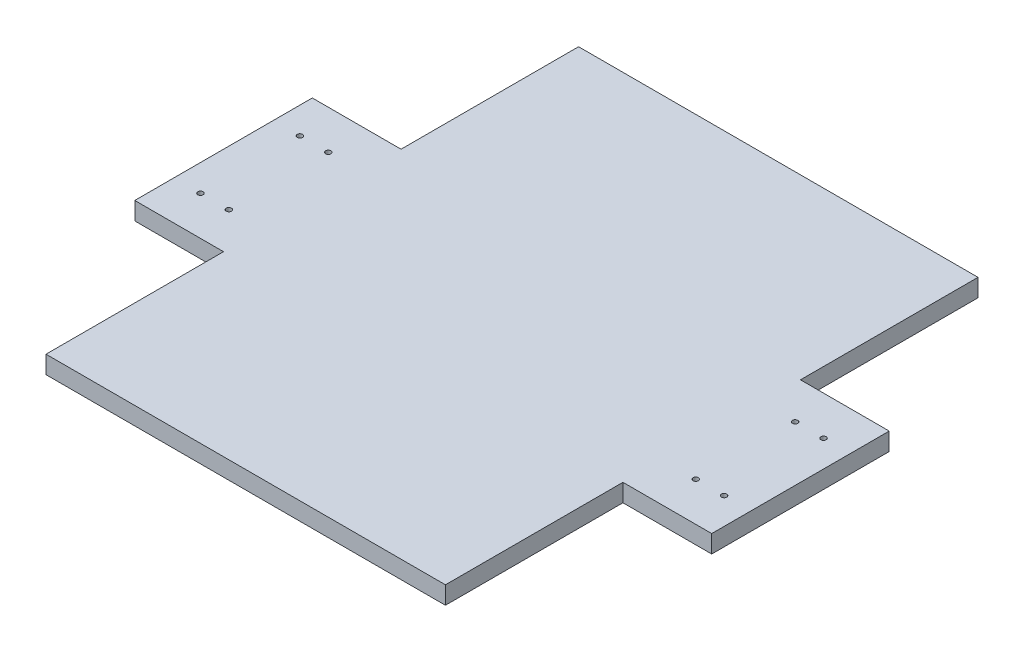
ISO-10303-21;
HEADER;
FILE_DESCRIPTION(('STEP AP214'),'2;1');
FILE_NAME('part.step','',(''),(''),'','','');
FILE_SCHEMA(('AUTOMOTIVE_DESIGN { 1 0 10303 214 1 1 1 1 }'));
ENDSEC;
DATA;
#1=APPLICATION_CONTEXT('core data for automotive mechanical design processes');
#2=APPLICATION_PROTOCOL_DEFINITION('international standard','automotive_design',2000,#1);
#3=PRODUCT_CONTEXT('',#1,'mechanical');
#4=PRODUCT('Part','Part','',(#3));
#5=PRODUCT_RELATED_PRODUCT_CATEGORY('part','',(#4));
#6=PRODUCT_DEFINITION_FORMATION('','',#4);
#7=PRODUCT_DEFINITION_CONTEXT('part definition',#1,'design');
#8=PRODUCT_DEFINITION('design','',#6,#7);
#9=PRODUCT_DEFINITION_SHAPE('','',#8);
#10=(LENGTH_UNIT() NAMED_UNIT(*) SI_UNIT(.MILLI.,.METRE.));
#11=(NAMED_UNIT(*) PLANE_ANGLE_UNIT() SI_UNIT($,.RADIAN.));
#12=(NAMED_UNIT(*) SI_UNIT($,.STERADIAN.) SOLID_ANGLE_UNIT());
#13=UNCERTAINTY_MEASURE_WITH_UNIT(LENGTH_MEASURE(1.E-05),#10,'distance_accuracy_value','');
#14=(GEOMETRIC_REPRESENTATION_CONTEXT(3) GLOBAL_UNCERTAINTY_ASSIGNED_CONTEXT((#13)) GLOBAL_UNIT_ASSIGNED_CONTEXT((#10,
#11,#12)) REPRESENTATION_CONTEXT('',''));
#15=CARTESIAN_POINT('',(0.,0.,0.));
#16=DIRECTION('',(0.,0.,1.));
#17=DIRECTION('',(1.,0.,0.));
#18=AXIS2_PLACEMENT_3D('',#15,#16,#17);
#19=CARTESIAN_POINT('',(225.,20.,300.));
#20=DIRECTION('',(-1.,0.,0.));
#21=DIRECTION('',(0.,0.,1.));
#22=AXIS2_PLACEMENT_3D('',#19,#20,#21);
#23=PLANE('',#22);
#24=DIRECTION('',(0.,0.,-1.));
#25=VECTOR('',#24,1.);
#26=CARTESIAN_POINT('',(225.,0.,300.));
#27=LINE('',#26,#25);
#28=CARTESIAN_POINT('',(225.,0.,300.));
#29=VERTEX_POINT('',#28);
#30=CARTESIAN_POINT('',(225.,0.,100.));
#31=VERTEX_POINT('',#30);
#32=EDGE_CURVE('E153',#29,#31,#27,.T.);
#33=ORIENTED_EDGE('',*,*,#32,.T.);
#34=DIRECTION('',(0.,-1.,0.));
#35=VECTOR('',#34,1.);
#36=CARTESIAN_POINT('',(225.,20.,100.));
#37=LINE('',#36,#35);
#38=CARTESIAN_POINT('',(225.,20.,100.));
#39=VERTEX_POINT('',#38);
#40=EDGE_CURVE('E11',#39,#31,#37,.T.);
#41=ORIENTED_EDGE('',*,*,#40,.F.);
#42=DIRECTION('',(0.,0.,-1.));
#43=VECTOR('',#42,1.);
#44=CARTESIAN_POINT('',(225.,20.,300.));
#45=LINE('',#44,#43);
#46=CARTESIAN_POINT('',(225.,20.,300.));
#47=VERTEX_POINT('',#46);
#48=EDGE_CURVE('E176',#47,#39,#45,.T.);
#49=ORIENTED_EDGE('',*,*,#48,.F.);
#50=DIRECTION('',(0.,-1.,0.));
#51=VECTOR('',#50,1.);
#52=CARTESIAN_POINT('',(225.,20.,300.));
#53=LINE('',#52,#51);
#54=EDGE_CURVE('E149',#47,#29,#53,.T.);
#55=ORIENTED_EDGE('',*,*,#54,.T.);
#56=EDGE_LOOP('',(#33,#41,#49,#55));
#57=FACE_BOUND('',#56,.T.);
#58=ADVANCED_FACE('F33',(#57),#23,.F.);
#59=CARTESIAN_POINT('',(325.,20.,100.));
#60=DIRECTION('',(0.,0.,-1.));
#61=DIRECTION('',(-1.,0.,0.));
#62=AXIS2_PLACEMENT_3D('',#59,#60,#61);
#63=PLANE('',#62);
#64=DIRECTION('',(1.,0.,0.));
#65=VECTOR('',#64,1.);
#66=CARTESIAN_POINT('',(325.,0.,100.));
#67=LINE('',#66,#65);
#68=CARTESIAN_POINT('',(325.,0.,100.));
#69=VERTEX_POINT('',#68);
#70=EDGE_CURVE('E156',#31,#69,#67,.T.);
#71=ORIENTED_EDGE('',*,*,#70,.T.);
#72=DIRECTION('',(0.,-1.,0.));
#73=VECTOR('',#72,1.);
#74=CARTESIAN_POINT('',(325.,20.,100.));
#75=LINE('',#74,#73);
#76=CARTESIAN_POINT('',(325.,20.,100.));
#77=VERTEX_POINT('',#76);
#78=EDGE_CURVE('E41',#77,#69,#75,.T.);
#79=ORIENTED_EDGE('',*,*,#78,.F.);
#80=DIRECTION('',(1.,0.,0.));
#81=VECTOR('',#80,1.);
#82=CARTESIAN_POINT('',(325.,20.,100.));
#83=LINE('',#82,#81);
#84=EDGE_CURVE('E104',#39,#77,#83,.T.);
#85=ORIENTED_EDGE('',*,*,#84,.F.);
#86=ORIENTED_EDGE('',*,*,#40,.T.);
#87=EDGE_LOOP('',(#71,#79,#85,#86));
#88=FACE_BOUND('',#87,.T.);
#89=ADVANCED_FACE('F256',(#88),#63,.F.);
#90=CARTESIAN_POINT('',(325.,20.,100.));
#91=DIRECTION('',(-1.,0.,0.));
#92=DIRECTION('',(0.,0.,1.));
#93=AXIS2_PLACEMENT_3D('',#90,#91,#92);
#94=PLANE('',#93);
#95=DIRECTION('',(0.,0.,-1.));
#96=VECTOR('',#95,1.);
#97=CARTESIAN_POINT('',(325.,0.,100.));
#98=LINE('',#97,#96);
#99=CARTESIAN_POINT('',(325.,0.,-100.));
#100=VERTEX_POINT('',#99);
#101=EDGE_CURVE('E159',#69,#100,#98,.T.);
#102=ORIENTED_EDGE('',*,*,#101,.T.);
#103=DIRECTION('',(0.,-1.,0.));
#104=VECTOR('',#103,1.);
#105=CARTESIAN_POINT('',(325.,20.,-100.));
#106=LINE('',#105,#104);
#107=CARTESIAN_POINT('',(325.,20.,-100.));
#108=VERTEX_POINT('',#107);
#109=EDGE_CURVE('E195',#108,#100,#106,.T.);
#110=ORIENTED_EDGE('',*,*,#109,.F.);
#111=DIRECTION('',(0.,0.,-1.));
#112=VECTOR('',#111,1.);
#113=CARTESIAN_POINT('',(325.,20.,100.));
#114=LINE('',#113,#112);
#115=EDGE_CURVE('E203',#77,#108,#114,.T.);
#116=ORIENTED_EDGE('',*,*,#115,.F.);
#117=ORIENTED_EDGE('',*,*,#78,.T.);
#118=EDGE_LOOP('',(#102,#110,#116,#117));
#119=FACE_BOUND('',#118,.T.);
#120=ADVANCED_FACE('F201',(#119),#94,.F.);
#121=CARTESIAN_POINT('',(325.,20.,-100.));
#122=DIRECTION('',(0.,0.,1.));
#123=DIRECTION('',(1.,0.,0.));
#124=AXIS2_PLACEMENT_3D('',#121,#122,#123);
#125=PLANE('',#124);
#126=DIRECTION('',(-1.,0.,0.));
#127=VECTOR('',#126,1.);
#128=CARTESIAN_POINT('',(325.,0.,-100.));
#129=LINE('',#128,#127);
#130=CARTESIAN_POINT('',(225.,0.,-100.));
#131=VERTEX_POINT('',#130);
#132=EDGE_CURVE('E161',#100,#131,#129,.T.);
#133=ORIENTED_EDGE('',*,*,#132,.T.);
#134=DIRECTION('',(0.,-1.,0.));
#135=VECTOR('',#134,1.);
#136=CARTESIAN_POINT('',(225.,20.,-100.));
#137=LINE('',#136,#135);
#138=CARTESIAN_POINT('',(225.,20.,-100.));
#139=VERTEX_POINT('',#138);
#140=EDGE_CURVE('E192',#139,#131,#137,.T.);
#141=ORIENTED_EDGE('',*,*,#140,.F.);
#142=DIRECTION('',(-1.,0.,0.));
#143=VECTOR('',#142,1.);
#144=CARTESIAN_POINT('',(325.,20.,-100.));
#145=LINE('',#144,#143);
#146=EDGE_CURVE('E221',#108,#139,#145,.T.);
#147=ORIENTED_EDGE('',*,*,#146,.F.);
#148=ORIENTED_EDGE('',*,*,#109,.T.);
#149=EDGE_LOOP('',(#133,#141,#147,#148));
#150=FACE_BOUND('',#149,.T.);
#151=ADVANCED_FACE('F212',(#150),#125,.F.);
#152=CARTESIAN_POINT('',(225.,20.,-300.));
#153=DIRECTION('',(-1.,0.,0.));
#154=DIRECTION('',(0.,0.,1.));
#155=AXIS2_PLACEMENT_3D('',#152,#153,#154);
#156=PLANE('',#155);
#157=DIRECTION('',(0.,0.,-1.));
#158=VECTOR('',#157,1.);
#159=CARTESIAN_POINT('',(225.,0.,-300.));
#160=LINE('',#159,#158);
#161=CARTESIAN_POINT('',(225.,0.,-300.));
#162=VERTEX_POINT('',#161);
#163=EDGE_CURVE('E163',#131,#162,#160,.T.);
#164=ORIENTED_EDGE('',*,*,#163,.T.);
#165=DIRECTION('',(0.,-1.,0.));
#166=VECTOR('',#165,1.);
#167=CARTESIAN_POINT('',(225.,20.,-300.));
#168=LINE('',#167,#166);
#169=CARTESIAN_POINT('',(225.,20.,-300.));
#170=VERTEX_POINT('',#169);
#171=EDGE_CURVE('E189',#170,#162,#168,.T.);
#172=ORIENTED_EDGE('',*,*,#171,.F.);
#173=DIRECTION('',(0.,0.,-1.));
#174=VECTOR('',#173,1.);
#175=CARTESIAN_POINT('',(225.,20.,-300.));
#176=LINE('',#175,#174);
#177=EDGE_CURVE('E218',#139,#170,#176,.T.);
#178=ORIENTED_EDGE('',*,*,#177,.F.);
#179=ORIENTED_EDGE('',*,*,#140,.T.);
#180=EDGE_LOOP('',(#164,#172,#178,#179));
#181=FACE_BOUND('',#180,.T.);
#182=ADVANCED_FACE('F216',(#181),#156,.F.);
#183=CARTESIAN_POINT('',(-225.,20.,-300.));
#184=DIRECTION('',(0.,0.,1.));
#185=DIRECTION('',(1.,0.,0.));
#186=AXIS2_PLACEMENT_3D('',#183,#184,#185);
#187=PLANE('',#186);
#188=DIRECTION('',(-1.,0.,0.));
#189=VECTOR('',#188,1.);
#190=CARTESIAN_POINT('',(-225.,0.,-300.));
#191=LINE('',#190,#189);
#192=CARTESIAN_POINT('',(-225.,0.,-300.));
#193=VERTEX_POINT('',#192);
#194=EDGE_CURVE('E165',#162,#193,#191,.T.);
#195=ORIENTED_EDGE('',*,*,#194,.T.);
#196=DIRECTION('',(0.,-1.,0.));
#197=VECTOR('',#196,1.);
#198=CARTESIAN_POINT('',(-225.,20.,-300.));
#199=LINE('',#198,#197);
#200=CARTESIAN_POINT('',(-225.,20.,-300.));
#201=VERTEX_POINT('',#200);
#202=EDGE_CURVE('E186',#201,#193,#199,.T.);
#203=ORIENTED_EDGE('',*,*,#202,.F.);
#204=DIRECTION('',(-1.,0.,0.));
#205=VECTOR('',#204,1.);
#206=CARTESIAN_POINT('',(-225.,20.,-300.));
#207=LINE('',#206,#205);
#208=EDGE_CURVE('E220',#170,#201,#207,.T.);
#209=ORIENTED_EDGE('',*,*,#208,.F.);
#210=ORIENTED_EDGE('',*,*,#171,.T.);
#211=EDGE_LOOP('',(#195,#203,#209,#210));
#212=FACE_BOUND('',#211,.T.);
#213=ADVANCED_FACE('F269',(#212),#187,.F.);
#214=CARTESIAN_POINT('',(-225.,20.,-300.));
#215=DIRECTION('',(1.,0.,0.));
#216=DIRECTION('',(0.,0.,-1.));
#217=AXIS2_PLACEMENT_3D('',#214,#215,#216);
#218=PLANE('',#217);
#219=DIRECTION('',(0.,0.,1.));
#220=VECTOR('',#219,1.);
#221=CARTESIAN_POINT('',(-225.,0.,-300.));
#222=LINE('',#221,#220);
#223=CARTESIAN_POINT('',(-225.,0.,-100.));
#224=VERTEX_POINT('',#223);
#225=EDGE_CURVE('E167',#193,#224,#222,.T.);
#226=ORIENTED_EDGE('',*,*,#225,.T.);
#227=DIRECTION('',(0.,-1.,0.));
#228=VECTOR('',#227,1.);
#229=CARTESIAN_POINT('',(-225.,20.,-100.));
#230=LINE('',#229,#228);
#231=CARTESIAN_POINT('',(-225.,20.,-100.));
#232=VERTEX_POINT('',#231);
#233=EDGE_CURVE('E183',#232,#224,#230,.T.);
#234=ORIENTED_EDGE('',*,*,#233,.F.);
#235=DIRECTION('',(0.,0.,1.));
#236=VECTOR('',#235,1.);
#237=CARTESIAN_POINT('',(-225.,20.,-300.));
#238=LINE('',#237,#236);
#239=EDGE_CURVE('E223',#201,#232,#238,.T.);
#240=ORIENTED_EDGE('',*,*,#239,.F.);
#241=ORIENTED_EDGE('',*,*,#202,.T.);
#242=EDGE_LOOP('',(#226,#234,#240,#241));
#243=FACE_BOUND('',#242,.T.);
#244=ADVANCED_FACE('F272',(#243),#218,.F.);
#245=CARTESIAN_POINT('',(-325.,20.,-100.));
#246=DIRECTION('',(0.,0.,1.));
#247=DIRECTION('',(1.,0.,0.));
#248=AXIS2_PLACEMENT_3D('',#245,#246,#247);
#249=PLANE('',#248);
#250=DIRECTION('',(-1.,0.,0.));
#251=VECTOR('',#250,1.);
#252=CARTESIAN_POINT('',(-325.,0.,-100.));
#253=LINE('',#252,#251);
#254=CARTESIAN_POINT('',(-325.,0.,-100.));
#255=VERTEX_POINT('',#254);
#256=EDGE_CURVE('E169',#224,#255,#253,.T.);
#257=ORIENTED_EDGE('',*,*,#256,.T.);
#258=DIRECTION('',(0.,-1.,0.));
#259=VECTOR('',#258,1.);
#260=CARTESIAN_POINT('',(-325.,20.,-100.));
#261=LINE('',#260,#259);
#262=CARTESIAN_POINT('',(-325.,20.,-100.));
#263=VERTEX_POINT('',#262);
#264=EDGE_CURVE('E180',#263,#255,#261,.T.);
#265=ORIENTED_EDGE('',*,*,#264,.F.);
#266=DIRECTION('',(-1.,0.,0.));
#267=VECTOR('',#266,1.);
#268=CARTESIAN_POINT('',(-325.,20.,-100.));
#269=LINE('',#268,#267);
#270=EDGE_CURVE('E229',#232,#263,#269,.T.);
#271=ORIENTED_EDGE('',*,*,#270,.F.);
#272=ORIENTED_EDGE('',*,*,#233,.T.);
#273=EDGE_LOOP('',(#257,#265,#271,#272));
#274=FACE_BOUND('',#273,.T.);
#275=ADVANCED_FACE('F235',(#274),#249,.F.);
#276=CARTESIAN_POINT('',(-325.,20.,100.));
#277=DIRECTION('',(1.,0.,0.));
#278=DIRECTION('',(0.,0.,-1.));
#279=AXIS2_PLACEMENT_3D('',#276,#277,#278);
#280=PLANE('',#279);
#281=DIRECTION('',(0.,0.,1.));
#282=VECTOR('',#281,1.);
#283=CARTESIAN_POINT('',(-325.,0.,100.));
#284=LINE('',#283,#282);
#285=CARTESIAN_POINT('',(-325.,0.,100.));
#286=VERTEX_POINT('',#285);
#287=EDGE_CURVE('E171',#255,#286,#284,.T.);
#288=ORIENTED_EDGE('',*,*,#287,.T.);
#289=DIRECTION('',(0.,-1.,0.));
#290=VECTOR('',#289,1.);
#291=CARTESIAN_POINT('',(-325.,20.,100.));
#292=LINE('',#291,#290);
#293=CARTESIAN_POINT('',(-325.,20.,100.));
#294=VERTEX_POINT('',#293);
#295=EDGE_CURVE('E144',#294,#286,#292,.T.);
#296=ORIENTED_EDGE('',*,*,#295,.F.);
#297=DIRECTION('',(0.,0.,1.));
#298=VECTOR('',#297,1.);
#299=CARTESIAN_POINT('',(-325.,20.,100.));
#300=LINE('',#299,#298);
#301=EDGE_CURVE('E135',#263,#294,#300,.T.);
#302=ORIENTED_EDGE('',*,*,#301,.F.);
#303=ORIENTED_EDGE('',*,*,#264,.T.);
#304=EDGE_LOOP('',(#288,#296,#302,#303));
#305=FACE_BOUND('',#304,.T.);
#306=ADVANCED_FACE('F239',(#305),#280,.F.);
#307=CARTESIAN_POINT('',(-325.,20.,100.));
#308=DIRECTION('',(0.,0.,-1.));
#309=DIRECTION('',(-1.,0.,0.));
#310=AXIS2_PLACEMENT_3D('',#307,#308,#309);
#311=PLANE('',#310);
#312=DIRECTION('',(1.,0.,0.));
#313=VECTOR('',#312,1.);
#314=CARTESIAN_POINT('',(-325.,0.,100.));
#315=LINE('',#314,#313);
#316=CARTESIAN_POINT('',(-225.,0.,100.));
#317=VERTEX_POINT('',#316);
#318=EDGE_CURVE('E143',#286,#317,#315,.T.);
#319=ORIENTED_EDGE('',*,*,#318,.T.);
#320=DIRECTION('',(0.,-1.,0.));
#321=VECTOR('',#320,1.);
#322=CARTESIAN_POINT('',(-225.,20.,100.));
#323=LINE('',#322,#321);
#324=CARTESIAN_POINT('',(-225.,20.,100.));
#325=VERTEX_POINT('',#324);
#326=EDGE_CURVE('E140',#325,#317,#323,.T.);
#327=ORIENTED_EDGE('',*,*,#326,.F.);
#328=DIRECTION('',(1.,0.,0.));
#329=VECTOR('',#328,1.);
#330=CARTESIAN_POINT('',(-325.,20.,100.));
#331=LINE('',#330,#329);
#332=EDGE_CURVE('E129',#294,#325,#331,.T.);
#333=ORIENTED_EDGE('',*,*,#332,.F.);
#334=ORIENTED_EDGE('',*,*,#295,.T.);
#335=EDGE_LOOP('',(#319,#327,#333,#334));
#336=FACE_BOUND('',#335,.T.);
#337=ADVANCED_FACE('F141',(#336),#311,.F.);
#338=CARTESIAN_POINT('',(-225.,20.,300.));
#339=DIRECTION('',(1.,0.,0.));
#340=DIRECTION('',(0.,0.,-1.));
#341=AXIS2_PLACEMENT_3D('',#338,#339,#340);
#342=PLANE('',#341);
#343=DIRECTION('',(0.,0.,1.));
#344=VECTOR('',#343,1.);
#345=CARTESIAN_POINT('',(-225.,0.,300.));
#346=LINE('',#345,#344);
#347=CARTESIAN_POINT('',(-225.,0.,300.));
#348=VERTEX_POINT('',#347);
#349=EDGE_CURVE('E90',#317,#348,#346,.T.);
#350=ORIENTED_EDGE('',*,*,#349,.T.);
#351=DIRECTION('',(0.,-1.,0.));
#352=VECTOR('',#351,1.);
#353=CARTESIAN_POINT('',(-225.,20.,300.));
#354=LINE('',#353,#352);
#355=CARTESIAN_POINT('',(-225.,20.,300.));
#356=VERTEX_POINT('',#355);
#357=EDGE_CURVE('E145',#356,#348,#354,.T.);
#358=ORIENTED_EDGE('',*,*,#357,.F.);
#359=DIRECTION('',(0.,0.,1.));
#360=VECTOR('',#359,1.);
#361=CARTESIAN_POINT('',(-225.,20.,300.));
#362=LINE('',#361,#360);
#363=EDGE_CURVE('E133',#325,#356,#362,.T.);
#364=ORIENTED_EDGE('',*,*,#363,.F.);
#365=ORIENTED_EDGE('',*,*,#326,.T.);
#366=EDGE_LOOP('',(#350,#358,#364,#365));
#367=FACE_BOUND('',#366,.T.);
#368=ADVANCED_FACE('F147',(#367),#342,.F.);
#369=CARTESIAN_POINT('',(-225.,20.,300.));
#370=DIRECTION('',(0.,0.,-1.));
#371=DIRECTION('',(-1.,0.,0.));
#372=AXIS2_PLACEMENT_3D('',#369,#370,#371);
#373=PLANE('',#372);
#374=DIRECTION('',(1.,0.,0.));
#375=VECTOR('',#374,1.);
#376=CARTESIAN_POINT('',(-225.,0.,300.));
#377=LINE('',#376,#375);
#378=EDGE_CURVE('E96',#348,#29,#377,.T.);
#379=ORIENTED_EDGE('',*,*,#378,.T.);
#380=ORIENTED_EDGE('',*,*,#54,.F.);
#381=DIRECTION('',(1.,0.,0.));
#382=VECTOR('',#381,1.);
#383=CARTESIAN_POINT('',(-225.,20.,300.));
#384=LINE('',#383,#382);
#385=EDGE_CURVE('E49',#356,#47,#384,.T.);
#386=ORIENTED_EDGE('',*,*,#385,.F.);
#387=ORIENTED_EDGE('',*,*,#357,.T.);
#388=EDGE_LOOP('',(#379,#380,#386,#387));
#389=FACE_BOUND('',#388,.T.);
#390=ADVANCED_FACE('F243',(#389),#373,.F.);
#391=CARTESIAN_POINT('',(0.,20.,0.));
#392=DIRECTION('',(0.,1.,0.));
#393=DIRECTION('',(0.,0.,1.));
#394=AXIS2_PLACEMENT_3D('',#391,#392,#393);
#395=PLANE('',#394);
#396=CARTESIAN_POINT('',(295.,20.,-56.));
#397=DIRECTION('',(0.,-1.,0.));
#398=DIRECTION('',(0.,0.,1.));
#399=AXIS2_PLACEMENT_3D('',#396,#397,#398);
#400=CIRCLE('',#399,2.99999999999999);
#401=CARTESIAN_POINT('',(295.,20.,-53.));
#402=VERTEX_POINT('',#401);
#403=EDGE_CURVE('E390',#402,#402,#400,.T.);
#404=ORIENTED_EDGE('',*,*,#403,.T.);
#405=EDGE_LOOP('',(#404));
#406=FACE_BOUND('',#405,.T.);
#407=CARTESIAN_POINT('',(263.,20.,-56.));
#408=DIRECTION('',(0.,-1.,0.));
#409=DIRECTION('',(0.,0.,1.));
#410=AXIS2_PLACEMENT_3D('',#407,#408,#409);
#411=CIRCLE('',#410,2.99999999999999);
#412=CARTESIAN_POINT('',(263.,20.,-53.));
#413=VERTEX_POINT('',#412);
#414=EDGE_CURVE('E458',#413,#413,#411,.T.);
#415=ORIENTED_EDGE('',*,*,#414,.T.);
#416=EDGE_LOOP('',(#415));
#417=FACE_BOUND('',#416,.T.);
#418=CARTESIAN_POINT('',(263.,20.,56.));
#419=DIRECTION('',(0.,-1.,0.));
#420=DIRECTION('',(0.,0.,1.));
#421=AXIS2_PLACEMENT_3D('',#418,#419,#420);
#422=CIRCLE('',#421,2.99999999999999);
#423=CARTESIAN_POINT('',(263.,20.,59.));
#424=VERTEX_POINT('',#423);
#425=EDGE_CURVE('E406',#424,#424,#422,.T.);
#426=ORIENTED_EDGE('',*,*,#425,.T.);
#427=EDGE_LOOP('',(#426));
#428=FACE_BOUND('',#427,.T.);
#429=CARTESIAN_POINT('',(295.,20.,56.));
#430=DIRECTION('',(0.,-1.,0.));
#431=DIRECTION('',(0.,0.,1.));
#432=AXIS2_PLACEMENT_3D('',#429,#430,#431);
#433=CIRCLE('',#432,2.99999999999999);
#434=CARTESIAN_POINT('',(295.,20.,59.));
#435=VERTEX_POINT('',#434);
#436=EDGE_CURVE('E399',#435,#435,#433,.T.);
#437=ORIENTED_EDGE('',*,*,#436,.T.);
#438=EDGE_LOOP('',(#437));
#439=FACE_BOUND('',#438,.T.);
#440=CARTESIAN_POINT('',(-295.,20.,-56.));
#441=DIRECTION('',(0.,1.,0.));
#442=DIRECTION('',(0.,0.,1.));
#443=AXIS2_PLACEMENT_3D('',#440,#441,#442);
#444=CIRCLE('',#443,2.99999999999999);
#445=CARTESIAN_POINT('',(-295.,20.,-53.));
#446=VERTEX_POINT('',#445);
#447=EDGE_CURVE('E402',#446,#446,#444,.T.);
#448=ORIENTED_EDGE('',*,*,#447,.F.);
#449=EDGE_LOOP('',(#448));
#450=FACE_BOUND('',#449,.T.);
#451=CARTESIAN_POINT('',(-263.,20.,-56.));
#452=DIRECTION('',(0.,1.,0.));
#453=DIRECTION('',(0.,0.,1.));
#454=AXIS2_PLACEMENT_3D('',#451,#452,#453);
#455=CIRCLE('',#454,2.99999999999999);
#456=CARTESIAN_POINT('',(-263.,20.,-53.));
#457=VERTEX_POINT('',#456);
#458=EDGE_CURVE('E415',#457,#457,#455,.T.);
#459=ORIENTED_EDGE('',*,*,#458,.F.);
#460=EDGE_LOOP('',(#459));
#461=FACE_BOUND('',#460,.T.);
#462=CARTESIAN_POINT('',(-263.,20.,56.));
#463=DIRECTION('',(0.,1.,0.));
#464=DIRECTION('',(0.,0.,1.));
#465=AXIS2_PLACEMENT_3D('',#462,#463,#464);
#466=CIRCLE('',#465,2.99999999999999);
#467=CARTESIAN_POINT('',(-263.,20.,59.));
#468=VERTEX_POINT('',#467);
#469=EDGE_CURVE('E407',#468,#468,#466,.T.);
#470=ORIENTED_EDGE('',*,*,#469,.F.);
#471=EDGE_LOOP('',(#470));
#472=FACE_BOUND('',#471,.T.);
#473=CARTESIAN_POINT('',(-295.,20.,56.));
#474=DIRECTION('',(0.,1.,0.));
#475=DIRECTION('',(0.,0.,1.));
#476=AXIS2_PLACEMENT_3D('',#473,#474,#475);
#477=CIRCLE('',#476,2.99999999999999);
#478=CARTESIAN_POINT('',(-295.,20.,59.));
#479=VERTEX_POINT('',#478);
#480=EDGE_CURVE('E414',#479,#479,#477,.T.);
#481=ORIENTED_EDGE('',*,*,#480,.F.);
#482=EDGE_LOOP('',(#481));
#483=FACE_BOUND('',#482,.T.);
#484=ORIENTED_EDGE('',*,*,#48,.T.);
#485=ORIENTED_EDGE('',*,*,#84,.T.);
#486=ORIENTED_EDGE('',*,*,#115,.T.);
#487=ORIENTED_EDGE('',*,*,#146,.T.);
#488=ORIENTED_EDGE('',*,*,#177,.T.);
#489=ORIENTED_EDGE('',*,*,#208,.T.);
#490=ORIENTED_EDGE('',*,*,#239,.T.);
#491=ORIENTED_EDGE('',*,*,#270,.T.);
#492=ORIENTED_EDGE('',*,*,#301,.T.);
#493=ORIENTED_EDGE('',*,*,#332,.T.);
#494=ORIENTED_EDGE('',*,*,#363,.T.);
#495=ORIENTED_EDGE('',*,*,#385,.T.);
#496=EDGE_LOOP('',(#484,#485,#486,#487,#488,#489,#490,#491,#492,#493,#494,#495));
#497=FACE_BOUND('',#496,.T.);
#498=ADVANCED_FACE('F131',(#406,#417,#428,#439,#450,#461,#472,#483,#497),#395,.T.);
#499=CARTESIAN_POINT('',(0.,0.,0.));
#500=DIRECTION('',(0.,1.,0.));
#501=DIRECTION('',(0.,0.,1.));
#502=AXIS2_PLACEMENT_3D('',#499,#500,#501);
#503=PLANE('',#502);
#504=CARTESIAN_POINT('',(295.,0.,-56.));
#505=DIRECTION('',(0.,1.,0.));
#506=DIRECTION('',(0.,0.,1.));
#507=AXIS2_PLACEMENT_3D('',#504,#505,#506);
#508=CIRCLE('',#507,2.99999999999999);
#509=CARTESIAN_POINT('',(295.,0.,-53.));
#510=VERTEX_POINT('',#509);
#511=EDGE_CURVE('E393',#510,#510,#508,.T.);
#512=ORIENTED_EDGE('',*,*,#511,.T.);
#513=EDGE_LOOP('',(#512));
#514=FACE_BOUND('',#513,.T.);
#515=CARTESIAN_POINT('',(263.,0.,-56.));
#516=DIRECTION('',(0.,1.,0.));
#517=DIRECTION('',(0.,0.,1.));
#518=AXIS2_PLACEMENT_3D('',#515,#516,#517);
#519=CIRCLE('',#518,2.99999999999999);
#520=CARTESIAN_POINT('',(263.,0.,-53.));
#521=VERTEX_POINT('',#520);
#522=EDGE_CURVE('E395',#521,#521,#519,.T.);
#523=ORIENTED_EDGE('',*,*,#522,.T.);
#524=EDGE_LOOP('',(#523));
#525=FACE_BOUND('',#524,.T.);
#526=CARTESIAN_POINT('',(263.,0.,56.));
#527=DIRECTION('',(0.,1.,0.));
#528=DIRECTION('',(0.,0.,1.));
#529=AXIS2_PLACEMENT_3D('',#526,#527,#528);
#530=CIRCLE('',#529,2.99999999999999);
#531=CARTESIAN_POINT('',(263.,0.,59.));
#532=VERTEX_POINT('',#531);
#533=EDGE_CURVE('E453',#532,#532,#530,.T.);
#534=ORIENTED_EDGE('',*,*,#533,.T.);
#535=EDGE_LOOP('',(#534));
#536=FACE_BOUND('',#535,.T.);
#537=CARTESIAN_POINT('',(295.,0.,56.));
#538=DIRECTION('',(0.,1.,0.));
#539=DIRECTION('',(0.,0.,1.));
#540=AXIS2_PLACEMENT_3D('',#537,#538,#539);
#541=CIRCLE('',#540,2.99999999999999);
#542=CARTESIAN_POINT('',(295.,0.,59.));
#543=VERTEX_POINT('',#542);
#544=EDGE_CURVE('E403',#543,#543,#541,.T.);
#545=ORIENTED_EDGE('',*,*,#544,.T.);
#546=EDGE_LOOP('',(#545));
#547=FACE_BOUND('',#546,.T.);
#548=CARTESIAN_POINT('',(-295.,0.,-56.));
#549=DIRECTION('',(0.,1.,0.));
#550=DIRECTION('',(0.,0.,1.));
#551=AXIS2_PLACEMENT_3D('',#548,#549,#550);
#552=CIRCLE('',#551,2.99999999999999);
#553=CARTESIAN_POINT('',(-295.,0.,-53.));
#554=VERTEX_POINT('',#553);
#555=EDGE_CURVE('E418',#554,#554,#552,.F.);
#556=ORIENTED_EDGE('',*,*,#555,.F.);
#557=EDGE_LOOP('',(#556));
#558=FACE_BOUND('',#557,.T.);
#559=CARTESIAN_POINT('',(-263.,0.,-56.));
#560=DIRECTION('',(0.,1.,0.));
#561=DIRECTION('',(0.,0.,1.));
#562=AXIS2_PLACEMENT_3D('',#559,#560,#561);
#563=CIRCLE('',#562,2.99999999999999);
#564=CARTESIAN_POINT('',(-263.,0.,-53.));
#565=VERTEX_POINT('',#564);
#566=EDGE_CURVE('E411',#565,#565,#563,.F.);
#567=ORIENTED_EDGE('',*,*,#566,.F.);
#568=EDGE_LOOP('',(#567));
#569=FACE_BOUND('',#568,.T.);
#570=CARTESIAN_POINT('',(-263.,0.,56.));
#571=DIRECTION('',(0.,1.,0.));
#572=DIRECTION('',(0.,0.,1.));
#573=AXIS2_PLACEMENT_3D('',#570,#571,#572);
#574=CIRCLE('',#573,2.99999999999999);
#575=CARTESIAN_POINT('',(-263.,0.,59.));
#576=VERTEX_POINT('',#575);
#577=EDGE_CURVE('E410',#576,#576,#574,.F.);
#578=ORIENTED_EDGE('',*,*,#577,.F.);
#579=EDGE_LOOP('',(#578));
#580=FACE_BOUND('',#579,.T.);
#581=CARTESIAN_POINT('',(-295.,0.,56.));
#582=DIRECTION('',(0.,1.,0.));
#583=DIRECTION('',(0.,0.,1.));
#584=AXIS2_PLACEMENT_3D('',#581,#582,#583);
#585=CIRCLE('',#584,2.99999999999999);
#586=CARTESIAN_POINT('',(-295.,0.,59.));
#587=VERTEX_POINT('',#586);
#588=EDGE_CURVE('E157',#587,#587,#585,.F.);
#589=ORIENTED_EDGE('',*,*,#588,.F.);
#590=EDGE_LOOP('',(#589));
#591=FACE_BOUND('',#590,.T.);
#592=ORIENTED_EDGE('',*,*,#32,.F.);
#593=ORIENTED_EDGE('',*,*,#378,.F.);
#594=ORIENTED_EDGE('',*,*,#349,.F.);
#595=ORIENTED_EDGE('',*,*,#318,.F.);
#596=ORIENTED_EDGE('',*,*,#287,.F.);
#597=ORIENTED_EDGE('',*,*,#256,.F.);
#598=ORIENTED_EDGE('',*,*,#225,.F.);
#599=ORIENTED_EDGE('',*,*,#194,.F.);
#600=ORIENTED_EDGE('',*,*,#163,.F.);
#601=ORIENTED_EDGE('',*,*,#132,.F.);
#602=ORIENTED_EDGE('',*,*,#101,.F.);
#603=ORIENTED_EDGE('',*,*,#70,.F.);
#604=EDGE_LOOP('',(#592,#593,#594,#595,#596,#597,#598,#599,#600,#601,#602,#603));
#605=FACE_BOUND('',#604,.T.);
#606=ADVANCED_FACE('F207',(#514,#525,#536,#547,#558,#569,#580,#591,#605),#503,.F.);
#607=CARTESIAN_POINT('',(-295.,-0.001000000000001,56.));
#608=DIRECTION('',(0.,1.,0.));
#609=DIRECTION('',(0.,0.,1.));
#610=AXIS2_PLACEMENT_3D('',#607,#608,#609);
#611=CYLINDRICAL_SURFACE('',#610,2.99999999999999);
#612=ORIENTED_EDGE('',*,*,#480,.T.);
#613=EDGE_LOOP('',(#612));
#614=FACE_BOUND('',#613,.T.);
#615=ORIENTED_EDGE('',*,*,#588,.T.);
#616=EDGE_LOOP('',(#615));
#617=FACE_BOUND('',#616,.T.);
#618=ADVANCED_FACE('F300',(#614,#617),#611,.F.);
#619=CARTESIAN_POINT('',(-263.,-0.001000000000001,56.));
#620=DIRECTION('',(0.,1.,0.));
#621=DIRECTION('',(0.,0.,1.));
#622=AXIS2_PLACEMENT_3D('',#619,#620,#621);
#623=CYLINDRICAL_SURFACE('',#622,2.99999999999999);
#624=ORIENTED_EDGE('',*,*,#469,.T.);
#625=EDGE_LOOP('',(#624));
#626=FACE_BOUND('',#625,.T.);
#627=ORIENTED_EDGE('',*,*,#577,.T.);
#628=EDGE_LOOP('',(#627));
#629=FACE_BOUND('',#628,.T.);
#630=ADVANCED_FACE('F305',(#626,#629),#623,.F.);
#631=CARTESIAN_POINT('',(-263.,-0.001000000000001,-56.));
#632=DIRECTION('',(0.,1.,0.));
#633=DIRECTION('',(0.,0.,1.));
#634=AXIS2_PLACEMENT_3D('',#631,#632,#633);
#635=CYLINDRICAL_SURFACE('',#634,2.99999999999999);
#636=ORIENTED_EDGE('',*,*,#458,.T.);
#637=EDGE_LOOP('',(#636));
#638=FACE_BOUND('',#637,.T.);
#639=ORIENTED_EDGE('',*,*,#566,.T.);
#640=EDGE_LOOP('',(#639));
#641=FACE_BOUND('',#640,.T.);
#642=ADVANCED_FACE('F317',(#638,#641),#635,.F.);
#643=CARTESIAN_POINT('',(-295.,-0.001000000000001,-56.));
#644=DIRECTION('',(0.,1.,0.));
#645=DIRECTION('',(0.,0.,1.));
#646=AXIS2_PLACEMENT_3D('',#643,#644,#645);
#647=CYLINDRICAL_SURFACE('',#646,2.99999999999999);
#648=ORIENTED_EDGE('',*,*,#447,.T.);
#649=EDGE_LOOP('',(#648));
#650=FACE_BOUND('',#649,.T.);
#651=ORIENTED_EDGE('',*,*,#555,.T.);
#652=EDGE_LOOP('',(#651));
#653=FACE_BOUND('',#652,.T.);
#654=ADVANCED_FACE('F327',(#650,#653),#647,.F.);
#655=CARTESIAN_POINT('',(295.,-0.001000000000001,56.));
#656=DIRECTION('',(0.,1.,0.));
#657=DIRECTION('',(0.,0.,1.));
#658=AXIS2_PLACEMENT_3D('',#655,#656,#657);
#659=CYLINDRICAL_SURFACE('',#658,2.99999999999999);
#660=ORIENTED_EDGE('',*,*,#436,.F.);
#661=EDGE_LOOP('',(#660));
#662=FACE_BOUND('',#661,.T.);
#663=ORIENTED_EDGE('',*,*,#544,.F.);
#664=EDGE_LOOP('',(#663));
#665=FACE_BOUND('',#664,.T.);
#666=ADVANCED_FACE('F336',(#662,#665),#659,.F.);
#667=CARTESIAN_POINT('',(263.,-0.001000000000001,56.));
#668=DIRECTION('',(0.,1.,0.));
#669=DIRECTION('',(0.,0.,1.));
#670=AXIS2_PLACEMENT_3D('',#667,#668,#669);
#671=CYLINDRICAL_SURFACE('',#670,2.99999999999999);
#672=ORIENTED_EDGE('',*,*,#425,.F.);
#673=EDGE_LOOP('',(#672));
#674=FACE_BOUND('',#673,.T.);
#675=ORIENTED_EDGE('',*,*,#533,.F.);
#676=EDGE_LOOP('',(#675));
#677=FACE_BOUND('',#676,.T.);
#678=ADVANCED_FACE('F353',(#674,#677),#671,.F.);
#679=CARTESIAN_POINT('',(263.,-0.001000000000001,-56.));
#680=DIRECTION('',(0.,1.,0.));
#681=DIRECTION('',(0.,0.,1.));
#682=AXIS2_PLACEMENT_3D('',#679,#680,#681);
#683=CYLINDRICAL_SURFACE('',#682,2.99999999999999);
#684=ORIENTED_EDGE('',*,*,#414,.F.);
#685=EDGE_LOOP('',(#684));
#686=FACE_BOUND('',#685,.T.);
#687=ORIENTED_EDGE('',*,*,#522,.F.);
#688=EDGE_LOOP('',(#687));
#689=FACE_BOUND('',#688,.T.);
#690=ADVANCED_FACE('F363',(#686,#689),#683,.F.);
#691=CARTESIAN_POINT('',(295.,-0.001000000000001,-56.));
#692=DIRECTION('',(0.,1.,0.));
#693=DIRECTION('',(0.,0.,1.));
#694=AXIS2_PLACEMENT_3D('',#691,#692,#693);
#695=CYLINDRICAL_SURFACE('',#694,2.99999999999999);
#696=ORIENTED_EDGE('',*,*,#403,.F.);
#697=EDGE_LOOP('',(#696));
#698=FACE_BOUND('',#697,.T.);
#699=ORIENTED_EDGE('',*,*,#511,.F.);
#700=EDGE_LOOP('',(#699));
#701=FACE_BOUND('',#700,.T.);
#702=ADVANCED_FACE('F373',(#698,#701),#695,.F.);
#703=CLOSED_SHELL('',(#58,#89,#120,#151,#182,#213,#244,#275,#306,#337,#368,#390,#498,#606,#618,
#630,#642,#654,#666,#678,#690,#702));
#704=MANIFOLD_SOLID_BREP('B2',#703);
#705=ADVANCED_BREP_SHAPE_REPRESENTATION('',(#18,#704),#14);
#706=SHAPE_DEFINITION_REPRESENTATION(#9,#705);
ENDSEC;
END-ISO-10303-21;
